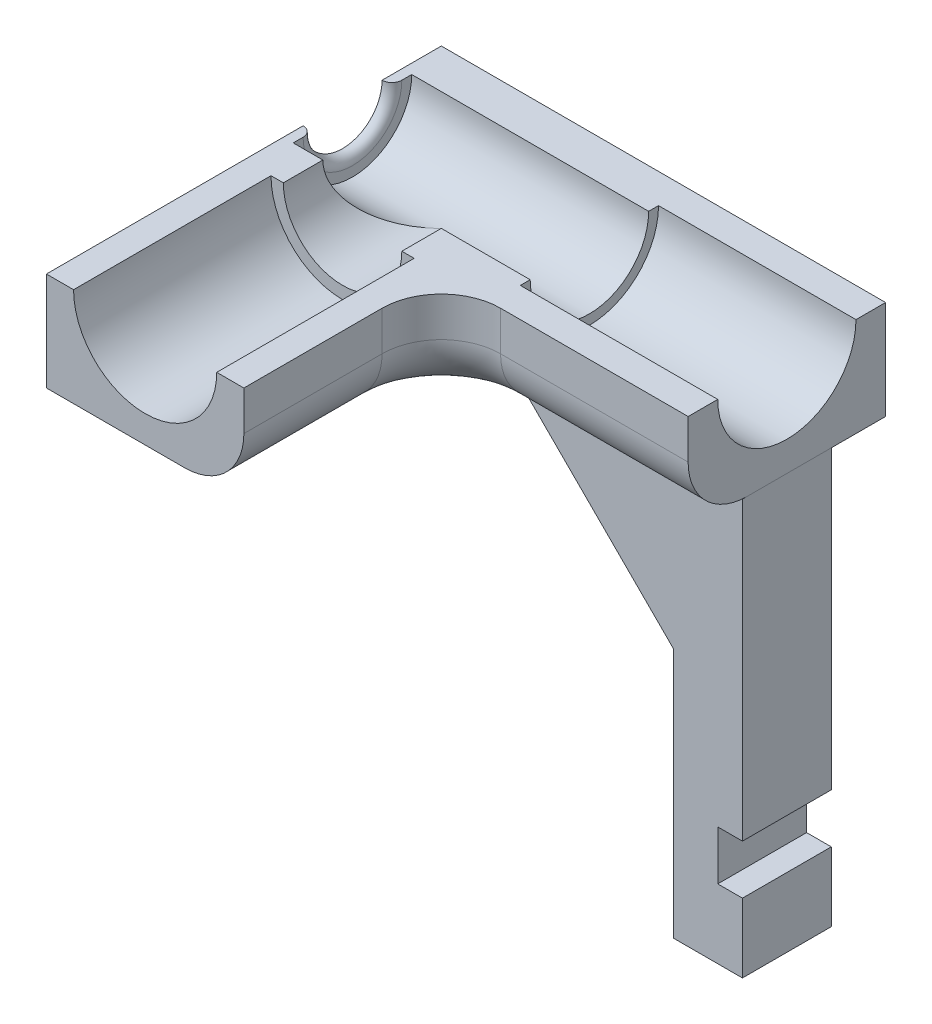
ISO-10303-21;
HEADER;
FILE_DESCRIPTION(('STEP AP214'),'2;1');
FILE_NAME('part.step','',(''),(''),'','','');
FILE_SCHEMA(('AUTOMOTIVE_DESIGN { 1 0 10303 214 1 1 1 1 }'));
ENDSEC;
DATA;
#1=APPLICATION_CONTEXT('core data for automotive mechanical design processes');
#2=APPLICATION_PROTOCOL_DEFINITION('international standard','automotive_design',2000,#1);
#3=PRODUCT_CONTEXT('',#1,'mechanical');
#4=PRODUCT('Part','Part','',(#3));
#5=PRODUCT_RELATED_PRODUCT_CATEGORY('part','',(#4));
#6=PRODUCT_DEFINITION_FORMATION('','',#4);
#7=PRODUCT_DEFINITION_CONTEXT('part definition',#1,'design');
#8=PRODUCT_DEFINITION('design','',#6,#7);
#9=PRODUCT_DEFINITION_SHAPE('','',#8);
#10=(LENGTH_UNIT() NAMED_UNIT(*) SI_UNIT(.MILLI.,.METRE.));
#11=(NAMED_UNIT(*) PLANE_ANGLE_UNIT() SI_UNIT($,.RADIAN.));
#12=(NAMED_UNIT(*) SI_UNIT($,.STERADIAN.) SOLID_ANGLE_UNIT());
#13=UNCERTAINTY_MEASURE_WITH_UNIT(LENGTH_MEASURE(1.E-05),#10,'distance_accuracy_value','');
#14=(GEOMETRIC_REPRESENTATION_CONTEXT(3) GLOBAL_UNCERTAINTY_ASSIGNED_CONTEXT((#13)) GLOBAL_UNIT_ASSIGNED_CONTEXT((#10,
#11,#12)) REPRESENTATION_CONTEXT('',''));
#15=CARTESIAN_POINT('',(0.,0.,0.));
#16=DIRECTION('',(0.,0.,1.));
#17=DIRECTION('',(1.,0.,0.));
#18=AXIS2_PLACEMENT_3D('',#15,#16,#17);
#19=CARTESIAN_POINT('',(11.3996849335085,-10.,14.5));
#20=DIRECTION('',(0.,1.,0.));
#21=DIRECTION('',(-1.,0.,0.));
#22=AXIS2_PLACEMENT_3D('',#19,#20,#21);
#23=PLANE('',#22);
#24=DIRECTION('',(1.,0.,0.));
#25=VECTOR('',#24,1.);
#26=CARTESIAN_POINT('',(11.3996849335085,-10.,5.5));
#27=LINE('',#26,#25);
#28=CARTESIAN_POINT('',(11.3996849335085,-10.,5.5));
#29=VERTEX_POINT('',#28);
#30=CARTESIAN_POINT('',(35.,-10.,5.5));
#31=VERTEX_POINT('',#30);
#32=EDGE_CURVE('E148',#29,#31,#27,.T.);
#33=ORIENTED_EDGE('',*,*,#32,.F.);
#34=DIRECTION('',(0.,0.,-1.));
#35=VECTOR('',#34,1.);
#36=CARTESIAN_POINT('',(11.3996849335085,-10.,14.5));
#37=LINE('',#36,#35);
#38=CARTESIAN_POINT('',(11.3996849335085,-10.,14.5));
#39=VERTEX_POINT('',#38);
#40=EDGE_CURVE('E12',#39,#29,#37,.T.);
#41=ORIENTED_EDGE('',*,*,#40,.F.);
#42=DIRECTION('',(1.,0.,0.));
#43=VECTOR('',#42,1.);
#44=CARTESIAN_POINT('',(11.3996849335085,-10.,14.5));
#45=LINE('',#44,#43);
#46=CARTESIAN_POINT('',(35.,-10.,14.5));
#47=VERTEX_POINT('',#46);
#48=EDGE_CURVE('E171',#39,#47,#45,.T.);
#49=ORIENTED_EDGE('',*,*,#48,.T.);
#50=DIRECTION('',(0.,0.,-1.));
#51=VECTOR('',#50,1.);
#52=CARTESIAN_POINT('',(35.,-10.,14.5));
#53=LINE('',#52,#51);
#54=EDGE_CURVE('E48',#47,#31,#53,.T.);
#55=ORIENTED_EDGE('',*,*,#54,.T.);
#56=EDGE_LOOP('',(#33,#41,#49,#55));
#57=FACE_BOUND('',#56,.T.);
#58=ADVANCED_FACE('F45',(#57),#23,.T.);
#59=CARTESIAN_POINT('',(11.3996849335085,-10.,14.5));
#60=DIRECTION('',(-0.707106781186549,-0.707106781186546,0.));
#61=DIRECTION('',(0.707106781186546,-0.707106781186549,0.));
#62=AXIS2_PLACEMENT_3D('',#59,#60,#61);
#63=PLANE('',#62);
#64=DIRECTION('',(-0.707106781186546,0.707106781186549,0.));
#65=VECTOR('',#64,1.);
#66=CARTESIAN_POINT('',(11.3996849335085,-10.,5.5));
#67=LINE('',#66,#65);
#68=CARTESIAN_POINT('',(28.,-26.6003150664916,5.5));
#69=VERTEX_POINT('',#68);
#70=EDGE_CURVE('E169',#69,#29,#67,.T.);
#71=ORIENTED_EDGE('',*,*,#70,.F.);
#72=DIRECTION('',(0.,0.,-1.));
#73=VECTOR('',#72,1.);
#74=CARTESIAN_POINT('',(28.,-26.6003150664916,14.5));
#75=LINE('',#74,#73);
#76=CARTESIAN_POINT('',(28.,-26.6003150664916,14.5));
#77=VERTEX_POINT('',#76);
#78=EDGE_CURVE('E54',#77,#69,#75,.T.);
#79=ORIENTED_EDGE('',*,*,#78,.F.);
#80=DIRECTION('',(-0.707106781186546,0.707106781186549,0.));
#81=VECTOR('',#80,1.);
#82=CARTESIAN_POINT('',(11.3996849335085,-10.,14.5));
#83=LINE('',#82,#81);
#84=EDGE_CURVE('E138',#77,#39,#83,.T.);
#85=ORIENTED_EDGE('',*,*,#84,.T.);
#86=ORIENTED_EDGE('',*,*,#40,.T.);
#87=EDGE_LOOP('',(#71,#79,#85,#86));
#88=FACE_BOUND('',#87,.T.);
#89=ADVANCED_FACE('F185',(#88),#63,.T.);
#90=CARTESIAN_POINT('',(28.,-52.0051934687711,14.5));
#91=DIRECTION('',(-1.,0.,0.));
#92=DIRECTION('',(0.,0.,1.));
#93=AXIS2_PLACEMENT_3D('',#90,#91,#92);
#94=PLANE('',#93);
#95=DIRECTION('',(0.,1.,0.));
#96=VECTOR('',#95,1.);
#97=CARTESIAN_POINT('',(28.,-52.0051934687711,5.5));
#98=LINE('',#97,#96);
#99=CARTESIAN_POINT('',(28.,-52.0051934687711,5.5));
#100=VERTEX_POINT('',#99);
#101=EDGE_CURVE('E125',#100,#69,#98,.T.);
#102=ORIENTED_EDGE('',*,*,#101,.F.);
#103=DIRECTION('',(0.,0.,-1.));
#104=VECTOR('',#103,1.);
#105=CARTESIAN_POINT('',(28.,-52.0051934687711,14.5));
#106=LINE('',#105,#104);
#107=CARTESIAN_POINT('',(28.,-52.0051934687711,14.5));
#108=VERTEX_POINT('',#107);
#109=EDGE_CURVE('E120',#108,#100,#106,.T.);
#110=ORIENTED_EDGE('',*,*,#109,.F.);
#111=DIRECTION('',(0.,1.,0.));
#112=VECTOR('',#111,1.);
#113=CARTESIAN_POINT('',(28.,-52.0051934687711,14.5));
#114=LINE('',#113,#112);
#115=EDGE_CURVE('E123',#108,#77,#114,.T.);
#116=ORIENTED_EDGE('',*,*,#115,.T.);
#117=ORIENTED_EDGE('',*,*,#78,.T.);
#118=EDGE_LOOP('',(#102,#110,#116,#117));
#119=FACE_BOUND('',#118,.T.);
#120=ADVANCED_FACE('F122',(#119),#94,.T.);
#121=CARTESIAN_POINT('',(35.,-52.0051934687711,14.5));
#122=DIRECTION('',(0.,-1.,0.));
#123=DIRECTION('',(0.,0.,-1.));
#124=AXIS2_PLACEMENT_3D('',#121,#122,#123);
#125=PLANE('',#124);
#126=DIRECTION('',(-1.,0.,0.));
#127=VECTOR('',#126,1.);
#128=CARTESIAN_POINT('',(35.,-52.0051934687711,5.5));
#129=LINE('',#128,#127);
#130=CARTESIAN_POINT('',(35.,-52.0051934687711,5.5));
#131=VERTEX_POINT('',#130);
#132=EDGE_CURVE('E166',#131,#100,#129,.T.);
#133=ORIENTED_EDGE('',*,*,#132,.F.);
#134=DIRECTION('',(0.,0.,-1.));
#135=VECTOR('',#134,1.);
#136=CARTESIAN_POINT('',(35.,-52.0051934687711,14.5));
#137=LINE('',#136,#135);
#138=CARTESIAN_POINT('',(35.,-52.0051934687711,14.5));
#139=VERTEX_POINT('',#138);
#140=EDGE_CURVE('E130',#139,#131,#137,.T.);
#141=ORIENTED_EDGE('',*,*,#140,.F.);
#142=DIRECTION('',(-1.,0.,0.));
#143=VECTOR('',#142,1.);
#144=CARTESIAN_POINT('',(35.,-52.0051934687711,14.5));
#145=LINE('',#144,#143);
#146=EDGE_CURVE('E136',#139,#108,#145,.T.);
#147=ORIENTED_EDGE('',*,*,#146,.T.);
#148=ORIENTED_EDGE('',*,*,#109,.T.);
#149=EDGE_LOOP('',(#133,#141,#147,#148));
#150=FACE_BOUND('',#149,.T.);
#151=ADVANCED_FACE('F140',(#150),#125,.T.);
#152=CARTESIAN_POINT('',(35.,-45.,14.5));
#153=DIRECTION('',(1.,0.,0.));
#154=DIRECTION('',(0.,0.,-1.));
#155=AXIS2_PLACEMENT_3D('',#152,#153,#154);
#156=PLANE('',#155);
#157=DIRECTION('',(0.,-1.,0.));
#158=VECTOR('',#157,1.);
#159=CARTESIAN_POINT('',(35.,-45.,5.5));
#160=LINE('',#159,#158);
#161=CARTESIAN_POINT('',(35.,-45.,5.5));
#162=VERTEX_POINT('',#161);
#163=EDGE_CURVE('E163',#162,#131,#160,.T.);
#164=ORIENTED_EDGE('',*,*,#163,.F.);
#165=DIRECTION('',(0.,0.,-1.));
#166=VECTOR('',#165,1.);
#167=CARTESIAN_POINT('',(35.,-45.,14.5));
#168=LINE('',#167,#166);
#169=CARTESIAN_POINT('',(35.,-45.,14.5));
#170=VERTEX_POINT('',#169);
#171=EDGE_CURVE('E175',#170,#162,#168,.T.);
#172=ORIENTED_EDGE('',*,*,#171,.F.);
#173=DIRECTION('',(0.,-1.,0.));
#174=VECTOR('',#173,1.);
#175=CARTESIAN_POINT('',(35.,-45.,14.5));
#176=LINE('',#175,#174);
#177=EDGE_CURVE('E141',#170,#139,#176,.T.);
#178=ORIENTED_EDGE('',*,*,#177,.T.);
#179=ORIENTED_EDGE('',*,*,#140,.T.);
#180=EDGE_LOOP('',(#164,#172,#178,#179));
#181=FACE_BOUND('',#180,.T.);
#182=ADVANCED_FACE('F198',(#181),#156,.T.);
#183=CARTESIAN_POINT('',(32.5,-45.,14.5));
#184=DIRECTION('',(0.,1.,0.));
#185=DIRECTION('',(0.,0.,1.));
#186=AXIS2_PLACEMENT_3D('',#183,#184,#185);
#187=PLANE('',#186);
#188=DIRECTION('',(1.,0.,0.));
#189=VECTOR('',#188,1.);
#190=CARTESIAN_POINT('',(32.5,-45.,5.5));
#191=LINE('',#190,#189);
#192=CARTESIAN_POINT('',(32.5,-45.,5.5));
#193=VERTEX_POINT('',#192);
#194=EDGE_CURVE('E160',#193,#162,#191,.T.);
#195=ORIENTED_EDGE('',*,*,#194,.F.);
#196=DIRECTION('',(0.,0.,-1.));
#197=VECTOR('',#196,1.);
#198=CARTESIAN_POINT('',(32.5,-45.,14.5));
#199=LINE('',#198,#197);
#200=CARTESIAN_POINT('',(32.5,-45.,14.5));
#201=VERTEX_POINT('',#200);
#202=EDGE_CURVE('E177',#201,#193,#199,.T.);
#203=ORIENTED_EDGE('',*,*,#202,.F.);
#204=DIRECTION('',(1.,0.,0.));
#205=VECTOR('',#204,1.);
#206=CARTESIAN_POINT('',(32.5,-45.,14.5));
#207=LINE('',#206,#205);
#208=EDGE_CURVE('E143',#201,#170,#207,.T.);
#209=ORIENTED_EDGE('',*,*,#208,.T.);
#210=ORIENTED_EDGE('',*,*,#171,.T.);
#211=EDGE_LOOP('',(#195,#203,#209,#210));
#212=FACE_BOUND('',#211,.T.);
#213=ADVANCED_FACE('F201',(#212),#187,.T.);
#214=CARTESIAN_POINT('',(32.5,-40.,14.5));
#215=DIRECTION('',(1.,0.,0.));
#216=DIRECTION('',(0.,0.,-1.));
#217=AXIS2_PLACEMENT_3D('',#214,#215,#216);
#218=PLANE('',#217);
#219=DIRECTION('',(0.,-1.,0.));
#220=VECTOR('',#219,1.);
#221=CARTESIAN_POINT('',(32.5,-40.,5.5));
#222=LINE('',#221,#220);
#223=CARTESIAN_POINT('',(32.5,-40.,5.5));
#224=VERTEX_POINT('',#223);
#225=EDGE_CURVE('E157',#224,#193,#222,.T.);
#226=ORIENTED_EDGE('',*,*,#225,.F.);
#227=DIRECTION('',(0.,0.,-1.));
#228=VECTOR('',#227,1.);
#229=CARTESIAN_POINT('',(32.5,-40.,14.5));
#230=LINE('',#229,#228);
#231=CARTESIAN_POINT('',(32.5,-40.,14.5));
#232=VERTEX_POINT('',#231);
#233=EDGE_CURVE('E179',#232,#224,#230,.T.);
#234=ORIENTED_EDGE('',*,*,#233,.F.);
#235=DIRECTION('',(0.,-1.,0.));
#236=VECTOR('',#235,1.);
#237=CARTESIAN_POINT('',(32.5,-40.,14.5));
#238=LINE('',#237,#236);
#239=EDGE_CURVE('E286',#232,#201,#238,.T.);
#240=ORIENTED_EDGE('',*,*,#239,.T.);
#241=ORIENTED_EDGE('',*,*,#202,.T.);
#242=EDGE_LOOP('',(#226,#234,#240,#241));
#243=FACE_BOUND('',#242,.T.);
#244=ADVANCED_FACE('F205',(#243),#218,.T.);
#245=CARTESIAN_POINT('',(35.,-40.,14.5));
#246=DIRECTION('',(0.,-1.,0.));
#247=DIRECTION('',(0.,0.,-1.));
#248=AXIS2_PLACEMENT_3D('',#245,#246,#247);
#249=PLANE('',#248);
#250=DIRECTION('',(-1.,0.,0.));
#251=VECTOR('',#250,1.);
#252=CARTESIAN_POINT('',(35.,-40.,5.5));
#253=LINE('',#252,#251);
#254=CARTESIAN_POINT('',(35.,-40.,5.5));
#255=VERTEX_POINT('',#254);
#256=EDGE_CURVE('E154',#255,#224,#253,.T.);
#257=ORIENTED_EDGE('',*,*,#256,.F.);
#258=DIRECTION('',(0.,0.,-1.));
#259=VECTOR('',#258,1.);
#260=CARTESIAN_POINT('',(35.,-40.,14.5));
#261=LINE('',#260,#259);
#262=CARTESIAN_POINT('',(35.,-40.,14.5));
#263=VERTEX_POINT('',#262);
#264=EDGE_CURVE('E180',#263,#255,#261,.T.);
#265=ORIENTED_EDGE('',*,*,#264,.F.);
#266=DIRECTION('',(-1.,0.,0.));
#267=VECTOR('',#266,1.);
#268=CARTESIAN_POINT('',(35.,-40.,14.5));
#269=LINE('',#268,#267);
#270=EDGE_CURVE('E290',#263,#232,#269,.T.);
#271=ORIENTED_EDGE('',*,*,#270,.T.);
#272=ORIENTED_EDGE('',*,*,#233,.T.);
#273=EDGE_LOOP('',(#257,#265,#271,#272));
#274=FACE_BOUND('',#273,.T.);
#275=ADVANCED_FACE('F209',(#274),#249,.T.);
#276=CARTESIAN_POINT('',(35.,-10.,14.5));
#277=DIRECTION('',(1.,0.,0.));
#278=DIRECTION('',(0.,1.,0.));
#279=AXIS2_PLACEMENT_3D('',#276,#277,#278);
#280=PLANE('',#279);
#281=DIRECTION('',(0.,-1.,0.));
#282=VECTOR('',#281,1.);
#283=CARTESIAN_POINT('',(35.,-10.,5.5));
#284=LINE('',#283,#282);
#285=EDGE_CURVE('E151',#31,#255,#284,.T.);
#286=ORIENTED_EDGE('',*,*,#285,.F.);
#287=ORIENTED_EDGE('',*,*,#54,.F.);
#288=DIRECTION('',(0.,-1.,0.));
#289=VECTOR('',#288,1.);
#290=CARTESIAN_POINT('',(35.,-10.,14.5));
#291=LINE('',#290,#289);
#292=EDGE_CURVE('E294',#47,#263,#291,.T.);
#293=ORIENTED_EDGE('',*,*,#292,.T.);
#294=ORIENTED_EDGE('',*,*,#264,.T.);
#295=EDGE_LOOP('',(#286,#287,#293,#294));
#296=FACE_BOUND('',#295,.T.);
#297=ADVANCED_FACE('F182',(#296),#280,.T.);
#298=CARTESIAN_POINT('',(0.,0.,14.5));
#299=DIRECTION('',(0.,0.,-1.));
#300=DIRECTION('',(-1.,0.,0.));
#301=AXIS2_PLACEMENT_3D('',#298,#299,#300);
#302=PLANE('',#301);
#303=ORIENTED_EDGE('',*,*,#48,.F.);
#304=ORIENTED_EDGE('',*,*,#84,.F.);
#305=ORIENTED_EDGE('',*,*,#115,.F.);
#306=ORIENTED_EDGE('',*,*,#146,.F.);
#307=ORIENTED_EDGE('',*,*,#177,.F.);
#308=ORIENTED_EDGE('',*,*,#208,.F.);
#309=ORIENTED_EDGE('',*,*,#239,.F.);
#310=ORIENTED_EDGE('',*,*,#270,.F.);
#311=ORIENTED_EDGE('',*,*,#292,.F.);
#312=EDGE_LOOP('',(#303,#304,#305,#306,#307,#308,#309,#310,#311));
#313=FACE_BOUND('',#312,.T.);
#314=ADVANCED_FACE('F134',(#313),#302,.F.);
#315=CARTESIAN_POINT('',(0.,0.,5.5));
#316=DIRECTION('',(0.,0.,-1.));
#317=DIRECTION('',(-1.,0.,0.));
#318=AXIS2_PLACEMENT_3D('',#315,#316,#317);
#319=PLANE('',#318);
#320=ORIENTED_EDGE('',*,*,#32,.T.);
#321=ORIENTED_EDGE('',*,*,#285,.T.);
#322=ORIENTED_EDGE('',*,*,#256,.T.);
#323=ORIENTED_EDGE('',*,*,#225,.T.);
#324=ORIENTED_EDGE('',*,*,#194,.T.);
#325=ORIENTED_EDGE('',*,*,#163,.T.);
#326=ORIENTED_EDGE('',*,*,#132,.T.);
#327=ORIENTED_EDGE('',*,*,#101,.T.);
#328=ORIENTED_EDGE('',*,*,#70,.T.);
#329=EDGE_LOOP('',(#320,#321,#322,#323,#324,#325,#326,#327,#328));
#330=FACE_BOUND('',#329,.T.);
#331=ADVANCED_FACE('F184',(#330),#319,.T.);
#332=CLOSED_SHELL('',(#58,#89,#120,#151,#182,#213,#244,#275,#297,#314,#331));
#333=MANIFOLD_SOLID_BREP('B2',#332);
#334=CARTESIAN_POINT('',(0.,0.,0.));
#335=DIRECTION('',(0.,1.,0.));
#336=DIRECTION('',(0.,0.,1.));
#337=AXIS2_PLACEMENT_3D('',#334,#335,#336);
#338=PLANE('',#337);
#339=DIRECTION('',(0.,0.,1.));
#340=VECTOR('',#339,1.);
#341=CARTESIAN_POINT('',(15.,0.,10.));
#342=LINE('',#341,#340);
#343=CARTESIAN_POINT('',(15.,0.,16.));
#344=VERTEX_POINT('',#343);
#345=CARTESIAN_POINT('',(15.,0.,17.));
#346=VERTEX_POINT('',#345);
#347=EDGE_CURVE('E545',#344,#346,#342,.T.);
#348=ORIENTED_EDGE('',*,*,#347,.F.);
#349=DIRECTION('',(1.,0.,0.));
#350=VECTOR('',#349,1.);
#351=CARTESIAN_POINT('',(-26.9705627484772,0.,16.));
#352=LINE('',#351,#350);
#353=CARTESIAN_POINT('',(6.,0.,16.));
#354=VERTEX_POINT('',#353);
#355=EDGE_CURVE('E560',#344,#354,#352,.F.);
#356=ORIENTED_EDGE('',*,*,#355,.T.);
#357=DIRECTION('',(0.,0.,1.));
#358=VECTOR('',#357,1.);
#359=CARTESIAN_POINT('',(6.,0.,-0.001000000000001));
#360=LINE('',#359,#358);
#361=CARTESIAN_POINT('',(6.,0.,20.));
#362=VERTEX_POINT('',#361);
#363=EDGE_CURVE('E457',#354,#362,#360,.T.);
#364=ORIENTED_EDGE('',*,*,#363,.T.);
#365=DIRECTION('',(-1.,0.,0.));
#366=VECTOR('',#365,1.);
#367=CARTESIAN_POINT('',(0.,0.,20.));
#368=LINE('',#367,#366);
#369=CARTESIAN_POINT('',(7.25,0.,20.));
#370=VERTEX_POINT('',#369);
#371=EDGE_CURVE('E549',#370,#362,#368,.T.);
#372=ORIENTED_EDGE('',*,*,#371,.F.);
#373=DIRECTION('',(0.,0.,1.));
#374=VECTOR('',#373,1.);
#375=CARTESIAN_POINT('',(7.25,0.,20.));
#376=LINE('',#375,#374);
#377=CARTESIAN_POINT('',(7.25,0.,40.));
#378=VERTEX_POINT('',#377);
#379=EDGE_CURVE('E583',#370,#378,#376,.T.);
#380=ORIENTED_EDGE('',*,*,#379,.T.);
#381=DIRECTION('',(-1.,0.,0.));
#382=VECTOR('',#381,1.);
#383=CARTESIAN_POINT('',(0.,0.,40.));
#384=LINE('',#383,#382);
#385=CARTESIAN_POINT('',(10.,0.,40.));
#386=VERTEX_POINT('',#385);
#387=EDGE_CURVE('E456',#386,#378,#384,.T.);
#388=ORIENTED_EDGE('',*,*,#387,.F.);
#389=DIRECTION('',(0.,0.,-1.));
#390=VECTOR('',#389,1.);
#391=CARTESIAN_POINT('',(10.,0.,40.));
#392=LINE('',#391,#390);
#393=CARTESIAN_POINT('',(10.,0.,26.));
#394=VERTEX_POINT('',#393);
#395=EDGE_CURVE('E440',#386,#394,#392,.T.);
#396=ORIENTED_EDGE('',*,*,#395,.T.);
#397=CARTESIAN_POINT('',(16.,0.,26.));
#398=DIRECTION('',(0.,1.,0.));
#399=DIRECTION('',(0.,0.,1.));
#400=AXIS2_PLACEMENT_3D('',#397,#398,#399);
#401=CIRCLE('',#400,6.);
#402=CARTESIAN_POINT('',(16.,0.,20.));
#403=VERTEX_POINT('',#402);
#404=EDGE_CURVE('E453',#394,#403,#401,.F.);
#405=ORIENTED_EDGE('',*,*,#404,.T.);
#406=DIRECTION('',(1.,0.,0.));
#407=VECTOR('',#406,1.);
#408=CARTESIAN_POINT('',(35.,0.,20.));
#409=LINE('',#408,#407);
#410=CARTESIAN_POINT('',(35.,0.,20.));
#411=VERTEX_POINT('',#410);
#412=EDGE_CURVE('E578',#403,#411,#409,.T.);
#413=ORIENTED_EDGE('',*,*,#412,.T.);
#414=DIRECTION('',(0.,0.,1.));
#415=VECTOR('',#414,1.);
#416=CARTESIAN_POINT('',(35.,0.,0.));
#417=LINE('',#416,#415);
#418=CARTESIAN_POINT('',(35.,0.,17.));
#419=VERTEX_POINT('',#418);
#420=EDGE_CURVE('E555',#419,#411,#417,.T.);
#421=ORIENTED_EDGE('',*,*,#420,.F.);
#422=DIRECTION('',(1.,0.,0.));
#423=VECTOR('',#422,1.);
#424=CARTESIAN_POINT('',(15.,0.,17.));
#425=LINE('',#424,#423);
#426=EDGE_CURVE('E466',#419,#346,#425,.F.);
#427=ORIENTED_EDGE('',*,*,#426,.T.);
#428=EDGE_LOOP('',(#348,#356,#364,#372,#380,#388,#396,#405,#413,#421,#427));
#429=FACE_BOUND('',#428,.T.);
#430=ADVANCED_FACE('F299',(#429),#338,.T.);
#431=CARTESIAN_POINT('',(-6.,0.,20.));
#432=VERTEX_POINT('',#431);
#433=CARTESIAN_POINT('',(-7.25,0.,20.));
#434=VERTEX_POINT('',#433);
#435=EDGE_CURVE('E548',#432,#434,#368,.T.);
#436=ORIENTED_EDGE('',*,*,#435,.F.);
#437=DIRECTION('',(0.,0.,1.));
#438=VECTOR('',#437,1.);
#439=CARTESIAN_POINT('',(-6.,0.,-0.001000000000001));
#440=LINE('',#439,#438);
#441=CARTESIAN_POINT('',(-6.,0.,16.));
#442=VERTEX_POINT('',#441);
#443=EDGE_CURVE('E567',#432,#442,#440,.F.);
#444=ORIENTED_EDGE('',*,*,#443,.T.);
#445=CARTESIAN_POINT('',(-9.,0.,16.));
#446=VERTEX_POINT('',#445);
#447=EDGE_CURVE('E561',#442,#446,#352,.F.);
#448=ORIENTED_EDGE('',*,*,#447,.T.);
#449=DIRECTION('',(0.,0.,1.));
#450=VECTOR('',#449,1.);
#451=CARTESIAN_POINT('',(-9.,0.,40.));
#452=LINE('',#451,#450);
#453=CARTESIAN_POINT('',(-9.,0.,15.));
#454=VERTEX_POINT('',#453);
#455=EDGE_CURVE('E551',#454,#446,#452,.T.);
#456=ORIENTED_EDGE('',*,*,#455,.F.);
#457=CARTESIAN_POINT('',(-10.,0.,15.));
#458=DIRECTION('',(0.,1.,0.));
#459=DIRECTION('',(0.,0.,1.));
#460=AXIS2_PLACEMENT_3D('',#457,#458,#459);
#461=CIRCLE('',#460,1.);
#462=CARTESIAN_POINT('',(-10.,0.,14.));
#463=VERTEX_POINT('',#462);
#464=EDGE_CURVE('E543',#463,#454,#461,.F.);
#465=ORIENTED_EDGE('',*,*,#464,.F.);
#466=DIRECTION('',(0.,0.,1.));
#467=VECTOR('',#466,1.);
#468=CARTESIAN_POINT('',(-10.,0.,40.));
#469=LINE('',#468,#467);
#470=CARTESIAN_POINT('',(-10.,0.,40.));
#471=VERTEX_POINT('',#470);
#472=EDGE_CURVE('E572',#463,#471,#469,.T.);
#473=ORIENTED_EDGE('',*,*,#472,.T.);
#474=CARTESIAN_POINT('',(-7.25,0.,40.));
#475=VERTEX_POINT('',#474);
#476=EDGE_CURVE('E558',#475,#471,#384,.T.);
#477=ORIENTED_EDGE('',*,*,#476,.F.);
#478=DIRECTION('',(0.,0.,1.));
#479=VECTOR('',#478,1.);
#480=CARTESIAN_POINT('',(-7.25,0.,20.));
#481=LINE('',#480,#479);
#482=EDGE_CURVE('E580',#475,#434,#481,.F.);
#483=ORIENTED_EDGE('',*,*,#482,.T.);
#484=EDGE_LOOP('',(#436,#444,#448,#456,#465,#473,#477,#483));
#485=FACE_BOUND('',#484,.T.);
#486=ADVANCED_FACE('F639',(#485),#338,.T.);
#487=CARTESIAN_POINT('',(35.,0.,0.));
#488=VERTEX_POINT('',#487);
#489=CARTESIAN_POINT('',(35.,0.,3.));
#490=VERTEX_POINT('',#489);
#491=EDGE_CURVE('E556',#488,#490,#417,.T.);
#492=ORIENTED_EDGE('',*,*,#491,.F.);
#493=DIRECTION('',(-1.,0.,0.));
#494=VECTOR('',#493,1.);
#495=CARTESIAN_POINT('',(0.,0.,0.));
#496=LINE('',#495,#494);
#497=CARTESIAN_POINT('',(-10.,0.,0.));
#498=VERTEX_POINT('',#497);
#499=EDGE_CURVE('E575',#488,#498,#496,.T.);
#500=ORIENTED_EDGE('',*,*,#499,.T.);
#501=CARTESIAN_POINT('',(-10.,0.,6.));
#502=VERTEX_POINT('',#501);
#503=EDGE_CURVE('E458',#498,#502,#469,.T.);
#504=ORIENTED_EDGE('',*,*,#503,.T.);
#505=CARTESIAN_POINT('',(-10.,0.,5.));
#506=DIRECTION('',(0.,1.,0.));
#507=DIRECTION('',(0.,0.,1.));
#508=AXIS2_PLACEMENT_3D('',#505,#506,#507);
#509=CIRCLE('',#508,1.);
#510=CARTESIAN_POINT('',(-9.,0.,5.));
#511=VERTEX_POINT('',#510);
#512=EDGE_CURVE('E473',#511,#502,#509,.F.);
#513=ORIENTED_EDGE('',*,*,#512,.F.);
#514=CARTESIAN_POINT('',(-9.,0.,4.));
#515=VERTEX_POINT('',#514);
#516=EDGE_CURVE('E552',#515,#511,#452,.T.);
#517=ORIENTED_EDGE('',*,*,#516,.F.);
#518=DIRECTION('',(1.,0.,0.));
#519=VECTOR('',#518,1.);
#520=CARTESIAN_POINT('',(-26.9705627484772,0.,4.));
#521=LINE('',#520,#519);
#522=CARTESIAN_POINT('',(15.,0.,4.));
#523=VERTEX_POINT('',#522);
#524=EDGE_CURVE('E564',#515,#523,#521,.T.);
#525=ORIENTED_EDGE('',*,*,#524,.T.);
#526=CARTESIAN_POINT('',(15.,0.,3.));
#527=VERTEX_POINT('',#526);
#528=EDGE_CURVE('E546',#527,#523,#342,.T.);
#529=ORIENTED_EDGE('',*,*,#528,.F.);
#530=DIRECTION('',(1.,0.,0.));
#531=VECTOR('',#530,1.);
#532=CARTESIAN_POINT('',(15.,0.,3.));
#533=LINE('',#532,#531);
#534=EDGE_CURVE('E463',#527,#490,#533,.T.);
#535=ORIENTED_EDGE('',*,*,#534,.T.);
#536=EDGE_LOOP('',(#492,#500,#504,#513,#517,#525,#529,#535));
#537=FACE_BOUND('',#536,.T.);
#538=ADVANCED_FACE('F631',(#537),#338,.T.);
#539=CARTESIAN_POINT('',(4.,-4.,40.));
#540=DIRECTION('',(0.,0.,-1.));
#541=DIRECTION('',(-1.,0.,0.));
#542=AXIS2_PLACEMENT_3D('',#539,#540,#541);
#543=CYLINDRICAL_SURFACE('',#542,6.);
#544=CARTESIAN_POINT('',(4.,-4.,40.));
#545=DIRECTION('',(0.,0.,1.));
#546=DIRECTION('',(1.,0.,0.));
#547=AXIS2_PLACEMENT_3D('',#544,#545,#546);
#548=CIRCLE('',#547,6.);
#549=CARTESIAN_POINT('',(4.,-10.,40.));
#550=VERTEX_POINT('',#549);
#551=CARTESIAN_POINT('',(10.,-4.,40.));
#552=VERTEX_POINT('',#551);
#553=EDGE_CURVE('E448',#550,#552,#548,.T.);
#554=ORIENTED_EDGE('',*,*,#553,.F.);
#555=DIRECTION('',(0.,0.,-1.));
#556=VECTOR('',#555,1.);
#557=CARTESIAN_POINT('',(4.,-10.,40.));
#558=LINE('',#557,#556);
#559=CARTESIAN_POINT('',(4.,-10.,26.));
#560=VERTEX_POINT('',#559);
#561=EDGE_CURVE('E526',#560,#550,#558,.F.);
#562=ORIENTED_EDGE('',*,*,#561,.F.);
#563=CARTESIAN_POINT('',(4.,-4.,26.));
#564=DIRECTION('',(0.,0.,-1.));
#565=DIRECTION('',(-1.,0.,0.));
#566=AXIS2_PLACEMENT_3D('',#563,#564,#565);
#567=CIRCLE('',#566,6.);
#568=CARTESIAN_POINT('',(10.,-4.,26.));
#569=VERTEX_POINT('',#568);
#570=EDGE_CURVE('E308',#569,#560,#567,.T.);
#571=ORIENTED_EDGE('',*,*,#570,.F.);
#572=DIRECTION('',(0.,0.,-1.));
#573=VECTOR('',#572,1.);
#574=CARTESIAN_POINT('',(10.,-4.,40.));
#575=LINE('',#574,#573);
#576=EDGE_CURVE('E443',#552,#569,#575,.T.);
#577=ORIENTED_EDGE('',*,*,#576,.F.);
#578=EDGE_LOOP('',(#554,#562,#571,#577));
#579=FACE_BOUND('',#578,.T.);
#580=ADVANCED_FACE('F614',(#579),#543,.T.);
#581=CARTESIAN_POINT('',(-10.,-10.,40.));
#582=DIRECTION('',(0.,1.,0.));
#583=DIRECTION('',(0.,0.,1.));
#584=AXIS2_PLACEMENT_3D('',#581,#582,#583);
#585=PLANE('',#584);
#586=CARTESIAN_POINT('',(16.,-10.,26.));
#587=DIRECTION('',(0.,1.,0.));
#588=DIRECTION('',(0.,0.,1.));
#589=AXIS2_PLACEMENT_3D('',#586,#587,#588);
#590=CIRCLE('',#589,12.);
#591=CARTESIAN_POINT('',(16.,-10.,14.));
#592=VERTEX_POINT('',#591);
#593=EDGE_CURVE('E530',#560,#592,#590,.F.);
#594=ORIENTED_EDGE('',*,*,#593,.F.);
#595=ORIENTED_EDGE('',*,*,#561,.T.);
#596=DIRECTION('',(1.,0.,0.));
#597=VECTOR('',#596,1.);
#598=CARTESIAN_POINT('',(-10.,-10.,40.));
#599=LINE('',#598,#597);
#600=CARTESIAN_POINT('',(-10.,-10.,40.));
#601=VERTEX_POINT('',#600);
#602=EDGE_CURVE('E481',#601,#550,#599,.T.);
#603=ORIENTED_EDGE('',*,*,#602,.F.);
#604=DIRECTION('',(0.,0.,-1.));
#605=VECTOR('',#604,1.);
#606=CARTESIAN_POINT('',(-10.,-10.,40.));
#607=LINE('',#606,#605);
#608=CARTESIAN_POINT('',(-10.,-10.,0.));
#609=VERTEX_POINT('',#608);
#610=EDGE_CURVE('E476',#601,#609,#607,.T.);
#611=ORIENTED_EDGE('',*,*,#610,.T.);
#612=DIRECTION('',(1.,0.,0.));
#613=VECTOR('',#612,1.);
#614=CARTESIAN_POINT('',(-10.,-10.,0.));
#615=LINE('',#614,#613);
#616=CARTESIAN_POINT('',(35.,-10.,0.));
#617=VERTEX_POINT('',#616);
#618=EDGE_CURVE('E483',#609,#617,#615,.T.);
#619=ORIENTED_EDGE('',*,*,#618,.T.);
#620=DIRECTION('',(0.,0.,-1.));
#621=VECTOR('',#620,1.);
#622=CARTESIAN_POINT('',(35.,-10.,20.));
#623=LINE('',#622,#621);
#624=CARTESIAN_POINT('',(35.,-10.,14.));
#625=VERTEX_POINT('',#624);
#626=EDGE_CURVE('E324',#625,#617,#623,.T.);
#627=ORIENTED_EDGE('',*,*,#626,.F.);
#628=DIRECTION('',(-1.,0.,0.));
#629=VECTOR('',#628,1.);
#630=CARTESIAN_POINT('',(-10.,-10.,14.));
#631=LINE('',#630,#629);
#632=EDGE_CURVE('E528',#625,#592,#631,.T.);
#633=ORIENTED_EDGE('',*,*,#632,.T.);
#634=EDGE_LOOP('',(#594,#595,#603,#611,#619,#627,#633));
#635=FACE_BOUND('',#634,.T.);
#636=ADVANCED_FACE('F618',(#635),#585,.F.);
#637=CARTESIAN_POINT('',(-10.,-4.,14.));
#638=DIRECTION('',(-1.,0.,0.));
#639=DIRECTION('',(0.,0.,1.));
#640=AXIS2_PLACEMENT_3D('',#637,#638,#639);
#641=CYLINDRICAL_SURFACE('',#640,6.);
#642=CARTESIAN_POINT('',(35.,-4.,14.));
#643=DIRECTION('',(1.,0.,0.));
#644=DIRECTION('',(0.,1.,0.));
#645=AXIS2_PLACEMENT_3D('',#642,#643,#644);
#646=CIRCLE('',#645,6.);
#647=CARTESIAN_POINT('',(35.,-4.,20.));
#648=VERTEX_POINT('',#647);
#649=EDGE_CURVE('E472',#648,#625,#646,.T.);
#650=ORIENTED_EDGE('',*,*,#649,.F.);
#651=DIRECTION('',(-1.,0.,0.));
#652=VECTOR('',#651,1.);
#653=CARTESIAN_POINT('',(35.,-4.,20.));
#654=LINE('',#653,#652);
#655=CARTESIAN_POINT('',(16.,-4.,20.));
#656=VERTEX_POINT('',#655);
#657=EDGE_CURVE('E477',#656,#648,#654,.F.);
#658=ORIENTED_EDGE('',*,*,#657,.F.);
#659=CARTESIAN_POINT('',(16.,-4.,14.));
#660=DIRECTION('',(-1.,0.,0.));
#661=DIRECTION('',(0.,0.,1.));
#662=AXIS2_PLACEMENT_3D('',#659,#660,#661);
#663=CIRCLE('',#662,6.);
#664=EDGE_CURVE('E513',#592,#656,#663,.T.);
#665=ORIENTED_EDGE('',*,*,#664,.F.);
#666=ORIENTED_EDGE('',*,*,#632,.F.);
#667=EDGE_LOOP('',(#650,#658,#665,#666));
#668=FACE_BOUND('',#667,.T.);
#669=ADVANCED_FACE('F623',(#668),#641,.T.);
#670=CARTESIAN_POINT('',(35.,10.,20.));
#671=DIRECTION('',(0.,0.,-1.));
#672=DIRECTION('',(0.,1.,0.));
#673=AXIS2_PLACEMENT_3D('',#670,#671,#672);
#674=PLANE('',#673);
#675=ORIENTED_EDGE('',*,*,#412,.F.);
#676=DIRECTION('',(0.,-1.,0.));
#677=VECTOR('',#676,1.);
#678=CARTESIAN_POINT('',(16.,-10.,20.));
#679=LINE('',#678,#677);
#680=EDGE_CURVE('E461',#403,#656,#679,.T.);
#681=ORIENTED_EDGE('',*,*,#680,.T.);
#682=ORIENTED_EDGE('',*,*,#657,.T.);
#683=DIRECTION('',(0.,-1.,0.));
#684=VECTOR('',#683,1.);
#685=CARTESIAN_POINT('',(35.,10.,20.));
#686=LINE('',#685,#684);
#687=EDGE_CURVE('E486',#411,#648,#686,.T.);
#688=ORIENTED_EDGE('',*,*,#687,.F.);
#689=EDGE_LOOP('',(#675,#681,#682,#688));
#690=FACE_BOUND('',#689,.T.);
#691=ADVANCED_FACE('F626',(#690),#674,.F.);
#692=CARTESIAN_POINT('',(16.,-4.,26.));
#693=DIRECTION('',(0.,1.,0.));
#694=DIRECTION('',(0.,0.,1.));
#695=AXIS2_PLACEMENT_3D('',#692,#693,#694);
#696=TOROIDAL_SURFACE('',#695,12.,6.);
#697=ORIENTED_EDGE('',*,*,#593,.T.);
#698=ORIENTED_EDGE('',*,*,#664,.T.);
#699=CARTESIAN_POINT('',(16.,-4.,26.));
#700=DIRECTION('',(0.,1.,0.));
#701=DIRECTION('',(0.,0.,1.));
#702=AXIS2_PLACEMENT_3D('',#699,#700,#701);
#703=CIRCLE('',#702,6.);
#704=EDGE_CURVE('E43',#569,#656,#703,.F.);
#705=ORIENTED_EDGE('',*,*,#704,.F.);
#706=ORIENTED_EDGE('',*,*,#570,.T.);
#707=EDGE_LOOP('',(#697,#698,#705,#706));
#708=FACE_BOUND('',#707,.T.);
#709=ADVANCED_FACE('F616',(#708),#696,.T.);
#710=CARTESIAN_POINT('',(10.,10.,40.));
#711=DIRECTION('',(-1.,0.,0.));
#712=DIRECTION('',(0.,-1.,0.));
#713=AXIS2_PLACEMENT_3D('',#710,#711,#712);
#714=PLANE('',#713);
#715=ORIENTED_EDGE('',*,*,#395,.F.);
#716=DIRECTION('',(0.,1.,0.));
#717=VECTOR('',#716,1.);
#718=CARTESIAN_POINT('',(10.,10.,40.));
#719=LINE('',#718,#717);
#720=EDGE_CURVE('E480',#552,#386,#719,.T.);
#721=ORIENTED_EDGE('',*,*,#720,.F.);
#722=ORIENTED_EDGE('',*,*,#576,.T.);
#723=DIRECTION('',(0.,-1.,0.));
#724=VECTOR('',#723,1.);
#725=CARTESIAN_POINT('',(10.,9.99999999999999,26.));
#726=LINE('',#725,#724);
#727=EDGE_CURVE('E436',#569,#394,#726,.F.);
#728=ORIENTED_EDGE('',*,*,#727,.T.);
#729=EDGE_LOOP('',(#715,#721,#722,#728));
#730=FACE_BOUND('',#729,.T.);
#731=ADVANCED_FACE('F438',(#730),#714,.F.);
#732=CARTESIAN_POINT('',(16.,9.99999999999999,26.));
#733=DIRECTION('',(0.,1.,0.));
#734=DIRECTION('',(-1.,0.,0.));
#735=AXIS2_PLACEMENT_3D('',#732,#733,#734);
#736=CYLINDRICAL_SURFACE('',#735,6.);
#737=ORIENTED_EDGE('',*,*,#404,.F.);
#738=ORIENTED_EDGE('',*,*,#727,.F.);
#739=ORIENTED_EDGE('',*,*,#704,.T.);
#740=ORIENTED_EDGE('',*,*,#680,.F.);
#741=EDGE_LOOP('',(#737,#738,#739,#740));
#742=FACE_BOUND('',#741,.T.);
#743=ADVANCED_FACE('F460',(#742),#736,.F.);
#744=CARTESIAN_POINT('',(0.,0.,0.));
#745=DIRECTION('',(0.,0.,1.));
#746=DIRECTION('',(1.,0.,0.));
#747=AXIS2_PLACEMENT_3D('',#744,#745,#746);
#748=PLANE('',#747);
#749=ORIENTED_EDGE('',*,*,#499,.F.);
#750=DIRECTION('',(0.,1.,0.));
#751=VECTOR('',#750,1.);
#752=CARTESIAN_POINT('',(35.,10.,0.));
#753=LINE('',#752,#751);
#754=EDGE_CURVE('E488',#617,#488,#753,.T.);
#755=ORIENTED_EDGE('',*,*,#754,.F.);
#756=ORIENTED_EDGE('',*,*,#618,.F.);
#757=DIRECTION('',(0.,-1.,0.));
#758=VECTOR('',#757,1.);
#759=CARTESIAN_POINT('',(-10.,10.,0.));
#760=LINE('',#759,#758);
#761=EDGE_CURVE('E484',#498,#609,#760,.T.);
#762=ORIENTED_EDGE('',*,*,#761,.F.);
#763=EDGE_LOOP('',(#749,#755,#756,#762));
#764=FACE_BOUND('',#763,.T.);
#765=ADVANCED_FACE('F648',(#764),#748,.F.);
#766=CARTESIAN_POINT('',(-26.9705627484772,0.,10.));
#767=DIRECTION('',(1.,0.,0.));
#768=DIRECTION('',(0.,1.,0.));
#769=AXIS2_PLACEMENT_3D('',#766,#767,#768);
#770=CYLINDRICAL_SURFACE('',#769,6.);
#771=ORIENTED_EDGE('',*,*,#355,.F.);
#772=CARTESIAN_POINT('',(15.,0.,10.));
#773=DIRECTION('',(1.,0.,0.));
#774=DIRECTION('',(0.,1.,0.));
#775=AXIS2_PLACEMENT_3D('',#772,#773,#774);
#776=CIRCLE('',#775,6.);
#777=EDGE_CURVE('E503',#523,#344,#776,.F.);
#778=ORIENTED_EDGE('',*,*,#777,.F.);
#779=ORIENTED_EDGE('',*,*,#524,.F.);
#780=CARTESIAN_POINT('',(-9.,0.,10.));
#781=DIRECTION('',(1.,0.,0.));
#782=DIRECTION('',(0.,1.,0.));
#783=AXIS2_PLACEMENT_3D('',#780,#781,#782);
#784=CIRCLE('',#783,6.);
#785=EDGE_CURVE('E490',#515,#446,#784,.F.);
#786=ORIENTED_EDGE('',*,*,#785,.T.);
#787=ORIENTED_EDGE('',*,*,#447,.F.);
#788=CARTESIAN_POINT('',(0.,0.,10.));
#789=DIRECTION('',(0.707106781186547,0.,0.707106781186548));
#790=DIRECTION('',(-0.707106781186547,0.,0.707106781186548));
#791=AXIS2_PLACEMENT_3D('',#788,#789,#790);
#792=ELLIPSE('',#791,8.48528137423857,6.);
#793=CARTESIAN_POINT('',(0.,-6.,10.));
#794=VERTEX_POINT('',#793);
#795=EDGE_CURVE('E493',#794,#442,#792,.F.);
#796=ORIENTED_EDGE('',*,*,#795,.F.);
#797=CARTESIAN_POINT('',(0.,0.,10.));
#798=DIRECTION('',(-0.707106781186547,0.,0.707106781186548));
#799=DIRECTION('',(0.707106781186547,0.,0.707106781186548));
#800=AXIS2_PLACEMENT_3D('',#797,#798,#799);
#801=ELLIPSE('',#800,8.48528137423857,6.);
#802=EDGE_CURVE('E316',#354,#794,#801,.F.);
#803=ORIENTED_EDGE('',*,*,#802,.F.);
#804=EDGE_LOOP('',(#771,#778,#779,#786,#787,#796,#803));
#805=FACE_BOUND('',#804,.T.);
#806=ADVANCED_FACE('F596',(#805),#770,.F.);
#807=CARTESIAN_POINT('',(15.,0.,10.));
#808=DIRECTION('',(1.,0.,0.));
#809=DIRECTION('',(0.,1.,0.));
#810=AXIS2_PLACEMENT_3D('',#807,#808,#809);
#811=PLANE('',#810);
#812=CARTESIAN_POINT('',(15.,0.,10.));
#813=DIRECTION('',(1.,0.,0.));
#814=DIRECTION('',(0.,1.,0.));
#815=AXIS2_PLACEMENT_3D('',#812,#813,#814);
#816=CIRCLE('',#815,7.);
#817=EDGE_CURVE('E506',#346,#527,#816,.T.);
#818=ORIENTED_EDGE('',*,*,#817,.T.);
#819=ORIENTED_EDGE('',*,*,#528,.T.);
#820=ORIENTED_EDGE('',*,*,#777,.T.);
#821=ORIENTED_EDGE('',*,*,#347,.T.);
#822=EDGE_LOOP('',(#818,#819,#820,#821));
#823=FACE_BOUND('',#822,.T.);
#824=ADVANCED_FACE('F592',(#823),#811,.T.);
#825=CARTESIAN_POINT('',(35.,0.,0.));
#826=DIRECTION('',(1.,0.,0.));
#827=DIRECTION('',(0.,1.,0.));
#828=AXIS2_PLACEMENT_3D('',#825,#826,#827);
#829=PLANE('',#828);
#830=ORIENTED_EDGE('',*,*,#754,.T.);
#831=ORIENTED_EDGE('',*,*,#491,.T.);
#832=CARTESIAN_POINT('',(35.,0.,10.));
#833=DIRECTION('',(1.,0.,0.));
#834=DIRECTION('',(0.,1.,0.));
#835=AXIS2_PLACEMENT_3D('',#832,#833,#834);
#836=CIRCLE('',#835,7.);
#837=EDGE_CURVE('E507',#419,#490,#836,.T.);
#838=ORIENTED_EDGE('',*,*,#837,.F.);
#839=ORIENTED_EDGE('',*,*,#420,.T.);
#840=ORIENTED_EDGE('',*,*,#687,.T.);
#841=ORIENTED_EDGE('',*,*,#649,.T.);
#842=ORIENTED_EDGE('',*,*,#626,.T.);
#843=EDGE_LOOP('',(#830,#831,#838,#839,#840,#841,#842));
#844=FACE_BOUND('',#843,.T.);
#845=ADVANCED_FACE('F627',(#844),#829,.T.);
#846=CARTESIAN_POINT('',(15.,0.,10.));
#847=DIRECTION('',(1.,0.,0.));
#848=DIRECTION('',(0.,1.,0.));
#849=AXIS2_PLACEMENT_3D('',#846,#847,#848);
#850=CYLINDRICAL_SURFACE('',#849,7.);
#851=ORIENTED_EDGE('',*,*,#426,.F.);
#852=ORIENTED_EDGE('',*,*,#837,.T.);
#853=ORIENTED_EDGE('',*,*,#534,.F.);
#854=ORIENTED_EDGE('',*,*,#817,.F.);
#855=EDGE_LOOP('',(#851,#852,#853,#854));
#856=FACE_BOUND('',#855,.T.);
#857=ADVANCED_FACE('F589',(#856),#850,.F.);
#858=CARTESIAN_POINT('',(-9.,10.,40.));
#859=DIRECTION('',(1.,0.,0.));
#860=DIRECTION('',(0.,1.,0.));
#861=AXIS2_PLACEMENT_3D('',#858,#859,#860);
#862=PLANE('',#861);
#863=ORIENTED_EDGE('',*,*,#785,.F.);
#864=ORIENTED_EDGE('',*,*,#516,.T.);
#865=CARTESIAN_POINT('',(-9.,0.,10.));
#866=DIRECTION('',(1.,0.,0.));
#867=DIRECTION('',(0.,1.,0.));
#868=AXIS2_PLACEMENT_3D('',#865,#866,#867);
#869=CIRCLE('',#868,5.);
#870=EDGE_CURVE('E470',#511,#454,#869,.F.);
#871=ORIENTED_EDGE('',*,*,#870,.T.);
#872=ORIENTED_EDGE('',*,*,#455,.T.);
#873=EDGE_LOOP('',(#863,#864,#871,#872));
#874=FACE_BOUND('',#873,.T.);
#875=ADVANCED_FACE('F635',(#874),#862,.T.);
#876=CARTESIAN_POINT('',(-10.,10.,40.));
#877=DIRECTION('',(1.,0.,0.));
#878=DIRECTION('',(0.,1.,0.));
#879=AXIS2_PLACEMENT_3D('',#876,#877,#878);
#880=PLANE('',#879);
#881=ORIENTED_EDGE('',*,*,#503,.F.);
#882=ORIENTED_EDGE('',*,*,#761,.T.);
#883=ORIENTED_EDGE('',*,*,#610,.F.);
#884=DIRECTION('',(0.,-1.,0.));
#885=VECTOR('',#884,1.);
#886=CARTESIAN_POINT('',(-10.,10.,40.));
#887=LINE('',#886,#885);
#888=EDGE_CURVE('E478',#471,#601,#887,.T.);
#889=ORIENTED_EDGE('',*,*,#888,.F.);
#890=ORIENTED_EDGE('',*,*,#472,.F.);
#891=CARTESIAN_POINT('',(-10.,0.,10.));
#892=DIRECTION('',(-1.,0.,0.));
#893=DIRECTION('',(0.,-1.,0.));
#894=AXIS2_PLACEMENT_3D('',#891,#892,#893);
#895=CIRCLE('',#894,4.);
#896=EDGE_CURVE('E303',#502,#463,#895,.T.);
#897=ORIENTED_EDGE('',*,*,#896,.F.);
#898=EDGE_LOOP('',(#881,#882,#883,#889,#890,#897));
#899=FACE_BOUND('',#898,.T.);
#900=ADVANCED_FACE('F645',(#899),#880,.F.);
#901=CARTESIAN_POINT('',(-10.,0.,10.));
#902=DIRECTION('',(1.,0.,0.));
#903=DIRECTION('',(0.,1.,0.));
#904=AXIS2_PLACEMENT_3D('',#901,#902,#903);
#905=TOROIDAL_SURFACE('',#904,5.,1.);
#906=ORIENTED_EDGE('',*,*,#896,.T.);
#907=ORIENTED_EDGE('',*,*,#464,.T.);
#908=ORIENTED_EDGE('',*,*,#870,.F.);
#909=ORIENTED_EDGE('',*,*,#512,.T.);
#910=EDGE_LOOP('',(#906,#907,#908,#909));
#911=FACE_BOUND('',#910,.T.);
#912=ADVANCED_FACE('F301',(#911),#905,.T.);
#913=CARTESIAN_POINT('',(0.,0.,-0.001000000000001));
#914=DIRECTION('',(0.,0.,1.));
#915=DIRECTION('',(1.,0.,0.));
#916=AXIS2_PLACEMENT_3D('',#913,#914,#915);
#917=CYLINDRICAL_SURFACE('',#916,6.);
#918=ORIENTED_EDGE('',*,*,#443,.F.);
#919=CARTESIAN_POINT('',(0.,0.,20.));
#920=DIRECTION('',(0.,0.,1.));
#921=DIRECTION('',(1.,0.,0.));
#922=AXIS2_PLACEMENT_3D('',#919,#920,#921);
#923=CIRCLE('',#922,6.);
#924=EDGE_CURVE('E496',#362,#432,#923,.F.);
#925=ORIENTED_EDGE('',*,*,#924,.F.);
#926=ORIENTED_EDGE('',*,*,#363,.F.);
#927=ORIENTED_EDGE('',*,*,#802,.T.);
#928=ORIENTED_EDGE('',*,*,#795,.T.);
#929=EDGE_LOOP('',(#918,#925,#926,#927,#928));
#930=FACE_BOUND('',#929,.T.);
#931=ADVANCED_FACE('F601',(#930),#917,.F.);
#932=CARTESIAN_POINT('',(0.,0.,20.));
#933=DIRECTION('',(0.,0.,1.));
#934=DIRECTION('',(1.,0.,0.));
#935=AXIS2_PLACEMENT_3D('',#932,#933,#934);
#936=PLANE('',#935);
#937=CARTESIAN_POINT('',(0.,0.,20.));
#938=DIRECTION('',(0.,0.,1.));
#939=DIRECTION('',(1.,0.,0.));
#940=AXIS2_PLACEMENT_3D('',#937,#938,#939);
#941=CIRCLE('',#940,7.25);
#942=EDGE_CURVE('E499',#434,#370,#941,.T.);
#943=ORIENTED_EDGE('',*,*,#942,.T.);
#944=ORIENTED_EDGE('',*,*,#371,.T.);
#945=ORIENTED_EDGE('',*,*,#924,.T.);
#946=ORIENTED_EDGE('',*,*,#435,.T.);
#947=EDGE_LOOP('',(#943,#944,#945,#946));
#948=FACE_BOUND('',#947,.T.);
#949=ADVANCED_FACE('F604',(#948),#936,.T.);
#950=CARTESIAN_POINT('',(0.,0.,40.));
#951=DIRECTION('',(0.,0.,1.));
#952=DIRECTION('',(1.,0.,0.));
#953=AXIS2_PLACEMENT_3D('',#950,#951,#952);
#954=PLANE('',#953);
#955=ORIENTED_EDGE('',*,*,#720,.T.);
#956=ORIENTED_EDGE('',*,*,#387,.T.);
#957=CARTESIAN_POINT('',(0.,0.,40.));
#958=DIRECTION('',(0.,0.,1.));
#959=DIRECTION('',(1.,0.,0.));
#960=AXIS2_PLACEMENT_3D('',#957,#958,#959);
#961=CIRCLE('',#960,7.25);
#962=EDGE_CURVE('E501',#475,#378,#961,.T.);
#963=ORIENTED_EDGE('',*,*,#962,.F.);
#964=ORIENTED_EDGE('',*,*,#476,.T.);
#965=ORIENTED_EDGE('',*,*,#888,.T.);
#966=ORIENTED_EDGE('',*,*,#602,.T.);
#967=ORIENTED_EDGE('',*,*,#553,.T.);
#968=EDGE_LOOP('',(#955,#956,#963,#964,#965,#966,#967));
#969=FACE_BOUND('',#968,.T.);
#970=ADVANCED_FACE('F611',(#969),#954,.T.);
#971=CARTESIAN_POINT('',(0.,0.,20.));
#972=DIRECTION('',(0.,0.,1.));
#973=DIRECTION('',(1.,0.,0.));
#974=AXIS2_PLACEMENT_3D('',#971,#972,#973);
#975=CYLINDRICAL_SURFACE('',#974,7.25);
#976=ORIENTED_EDGE('',*,*,#482,.F.);
#977=ORIENTED_EDGE('',*,*,#962,.T.);
#978=ORIENTED_EDGE('',*,*,#379,.F.);
#979=ORIENTED_EDGE('',*,*,#942,.F.);
#980=EDGE_LOOP('',(#976,#977,#978,#979));
#981=FACE_BOUND('',#980,.T.);
#982=ADVANCED_FACE('F608',(#981),#975,.F.);
#983=CLOSED_SHELL('',(#430,#486,#538,#580,#636,#669,#691,#709,#731,#743,#765,#806,#824,#845,
#857,#875,#900,#912,#931,#949,#970,#982));
#984=MANIFOLD_SOLID_BREP('B6',#983);
#985=ADVANCED_BREP_SHAPE_REPRESENTATION('',(#18,#333,#984),#14);
#986=SHAPE_DEFINITION_REPRESENTATION(#9,#985);
ENDSEC;
END-ISO-10303-21;
